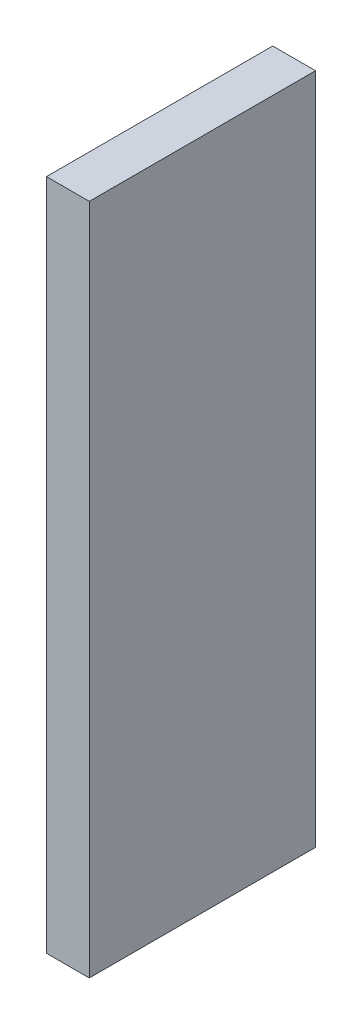
ISO-10303-21;
HEADER;
FILE_DESCRIPTION(('STEP AP214'),'2;1');
FILE_NAME('part.step','',(''),(''),'','','');
FILE_SCHEMA(('AUTOMOTIVE_DESIGN { 1 0 10303 214 1 1 1 1 }'));
ENDSEC;
DATA;
#1=APPLICATION_CONTEXT('core data for automotive mechanical design processes');
#2=APPLICATION_PROTOCOL_DEFINITION('international standard','automotive_design',2000,#1);
#3=PRODUCT_CONTEXT('',#1,'mechanical');
#4=PRODUCT('Part','Part','',(#3));
#5=PRODUCT_RELATED_PRODUCT_CATEGORY('part','',(#4));
#6=PRODUCT_DEFINITION_FORMATION('','',#4);
#7=PRODUCT_DEFINITION_CONTEXT('part definition',#1,'design');
#8=PRODUCT_DEFINITION('design','',#6,#7);
#9=PRODUCT_DEFINITION_SHAPE('','',#8);
#10=(LENGTH_UNIT() NAMED_UNIT(*) SI_UNIT(.MILLI.,.METRE.));
#11=(NAMED_UNIT(*) PLANE_ANGLE_UNIT() SI_UNIT($,.RADIAN.));
#12=(NAMED_UNIT(*) SI_UNIT($,.STERADIAN.) SOLID_ANGLE_UNIT());
#13=UNCERTAINTY_MEASURE_WITH_UNIT(LENGTH_MEASURE(1.E-05),#10,'distance_accuracy_value','');
#14=(GEOMETRIC_REPRESENTATION_CONTEXT(3) GLOBAL_UNCERTAINTY_ASSIGNED_CONTEXT((#13)) GLOBAL_UNIT_ASSIGNED_CONTEXT((#10,
#11,#12)) REPRESENTATION_CONTEXT('',''));
#15=CARTESIAN_POINT('',(0.,0.,0.));
#16=DIRECTION('',(0.,0.,1.));
#17=DIRECTION('',(1.,0.,0.));
#18=AXIS2_PLACEMENT_3D('',#15,#16,#17);
#19=CARTESIAN_POINT('',(2.80000000000001,0.,14.8));
#20=DIRECTION('',(0.,1.,0.));
#21=DIRECTION('',(-1.,0.,0.));
#22=AXIS2_PLACEMENT_3D('',#19,#20,#21);
#23=PLANE('',#22);
#24=DIRECTION('',(1.,0.,0.));
#25=VECTOR('',#24,1.);
#26=CARTESIAN_POINT('',(2.80000000000001,0.,0.));
#27=LINE('',#26,#25);
#28=CARTESIAN_POINT('',(0.,0.,0.));
#29=VERTEX_POINT('',#28);
#30=CARTESIAN_POINT('',(2.80000000000001,0.,0.));
#31=VERTEX_POINT('',#30);
#32=EDGE_CURVE('E111',#29,#31,#27,.T.);
#33=ORIENTED_EDGE('',*,*,#32,.T.);
#34=DIRECTION('',(0.,0.,-1.));
#35=VECTOR('',#34,1.);
#36=CARTESIAN_POINT('',(2.80000000000001,0.,14.8));
#37=LINE('',#36,#35);
#38=CARTESIAN_POINT('',(2.80000000000001,0.,14.8));
#39=VERTEX_POINT('',#38);
#40=EDGE_CURVE('E11',#39,#31,#37,.T.);
#41=ORIENTED_EDGE('',*,*,#40,.F.);
#42=DIRECTION('',(1.,0.,0.));
#43=VECTOR('',#42,1.);
#44=CARTESIAN_POINT('',(2.80000000000001,0.,14.8));
#45=LINE('',#44,#43);
#46=CARTESIAN_POINT('',(0.,0.,14.8));
#47=VERTEX_POINT('',#46);
#48=EDGE_CURVE('E95',#47,#39,#45,.T.);
#49=ORIENTED_EDGE('',*,*,#48,.F.);
#50=DIRECTION('',(0.,0.,-1.));
#51=VECTOR('',#50,1.);
#52=CARTESIAN_POINT('',(0.,0.,14.8));
#53=LINE('',#52,#51);
#54=EDGE_CURVE('E107',#47,#29,#53,.T.);
#55=ORIENTED_EDGE('',*,*,#54,.T.);
#56=EDGE_LOOP('',(#33,#41,#49,#55));
#57=FACE_BOUND('',#56,.T.);
#58=ADVANCED_FACE('F43',(#57),#23,.F.);
#59=CARTESIAN_POINT('',(2.8,44.,14.8));
#60=DIRECTION('',(-1.,0.,0.));
#61=DIRECTION('',(0.,-1.,0.));
#62=AXIS2_PLACEMENT_3D('',#59,#60,#61);
#63=PLANE('',#62);
#64=DIRECTION('',(0.,1.,0.));
#65=VECTOR('',#64,1.);
#66=CARTESIAN_POINT('',(2.8,44.,0.));
#67=LINE('',#66,#65);
#68=CARTESIAN_POINT('',(2.8,44.,0.));
#69=VERTEX_POINT('',#68);
#70=EDGE_CURVE('E100',#31,#69,#67,.T.);
#71=ORIENTED_EDGE('',*,*,#70,.T.);
#72=DIRECTION('',(0.,0.,-1.));
#73=VECTOR('',#72,1.);
#74=CARTESIAN_POINT('',(2.8,44.,14.8));
#75=LINE('',#74,#73);
#76=CARTESIAN_POINT('',(2.8,44.,14.8));
#77=VERTEX_POINT('',#76);
#78=EDGE_CURVE('E52',#77,#69,#75,.T.);
#79=ORIENTED_EDGE('',*,*,#78,.F.);
#80=DIRECTION('',(0.,1.,0.));
#81=VECTOR('',#80,1.);
#82=CARTESIAN_POINT('',(2.8,44.,14.8));
#83=LINE('',#82,#81);
#84=EDGE_CURVE('E90',#39,#77,#83,.T.);
#85=ORIENTED_EDGE('',*,*,#84,.F.);
#86=ORIENTED_EDGE('',*,*,#40,.T.);
#87=EDGE_LOOP('',(#71,#79,#85,#86));
#88=FACE_BOUND('',#87,.T.);
#89=ADVANCED_FACE('F99',(#88),#63,.F.);
#90=CARTESIAN_POINT('',(0.,44.,14.8));
#91=DIRECTION('',(0.,-1.,0.));
#92=DIRECTION('',(0.,0.,-1.));
#93=AXIS2_PLACEMENT_3D('',#90,#91,#92);
#94=PLANE('',#93);
#95=DIRECTION('',(-1.,0.,0.));
#96=VECTOR('',#95,1.);
#97=CARTESIAN_POINT('',(0.,44.,0.));
#98=LINE('',#97,#96);
#99=CARTESIAN_POINT('',(0.,44.,0.));
#100=VERTEX_POINT('',#99);
#101=EDGE_CURVE('E77',#69,#100,#98,.T.);
#102=ORIENTED_EDGE('',*,*,#101,.T.);
#103=DIRECTION('',(0.,0.,-1.));
#104=VECTOR('',#103,1.);
#105=CARTESIAN_POINT('',(0.,44.,14.8));
#106=LINE('',#105,#104);
#107=CARTESIAN_POINT('',(0.,44.,14.8));
#108=VERTEX_POINT('',#107);
#109=EDGE_CURVE('E102',#108,#100,#106,.T.);
#110=ORIENTED_EDGE('',*,*,#109,.F.);
#111=DIRECTION('',(-1.,0.,0.));
#112=VECTOR('',#111,1.);
#113=CARTESIAN_POINT('',(0.,44.,14.8));
#114=LINE('',#113,#112);
#115=EDGE_CURVE('E93',#77,#108,#114,.T.);
#116=ORIENTED_EDGE('',*,*,#115,.F.);
#117=ORIENTED_EDGE('',*,*,#78,.T.);
#118=EDGE_LOOP('',(#102,#110,#116,#117));
#119=FACE_BOUND('',#118,.T.);
#120=ADVANCED_FACE('F103',(#119),#94,.F.);
#121=CARTESIAN_POINT('',(0.,0.,14.8));
#122=DIRECTION('',(1.,0.,0.));
#123=DIRECTION('',(0.,0.,-1.));
#124=AXIS2_PLACEMENT_3D('',#121,#122,#123);
#125=PLANE('',#124);
#126=DIRECTION('',(0.,-1.,0.));
#127=VECTOR('',#126,1.);
#128=CARTESIAN_POINT('',(0.,0.,0.));
#129=LINE('',#128,#127);
#130=EDGE_CURVE('E83',#100,#29,#129,.T.);
#131=ORIENTED_EDGE('',*,*,#130,.T.);
#132=ORIENTED_EDGE('',*,*,#54,.F.);
#133=DIRECTION('',(0.,-1.,0.));
#134=VECTOR('',#133,1.);
#135=CARTESIAN_POINT('',(0.,0.,14.8));
#136=LINE('',#135,#134);
#137=EDGE_CURVE('E60',#108,#47,#136,.T.);
#138=ORIENTED_EDGE('',*,*,#137,.F.);
#139=ORIENTED_EDGE('',*,*,#109,.T.);
#140=EDGE_LOOP('',(#131,#132,#138,#139));
#141=FACE_BOUND('',#140,.T.);
#142=ADVANCED_FACE('F124',(#141),#125,.F.);
#143=CARTESIAN_POINT('',(0.,0.,14.8));
#144=DIRECTION('',(0.,0.,-1.));
#145=DIRECTION('',(-1.,0.,0.));
#146=AXIS2_PLACEMENT_3D('',#143,#144,#145);
#147=PLANE('',#146);
#148=ORIENTED_EDGE('',*,*,#48,.T.);
#149=ORIENTED_EDGE('',*,*,#84,.T.);
#150=ORIENTED_EDGE('',*,*,#115,.T.);
#151=ORIENTED_EDGE('',*,*,#137,.T.);
#152=EDGE_LOOP('',(#148,#149,#150,#151));
#153=FACE_BOUND('',#152,.T.);
#154=ADVANCED_FACE('F91',(#153),#147,.F.);
#155=CARTESIAN_POINT('',(0.,0.,0.));
#156=DIRECTION('',(0.,0.,-1.));
#157=DIRECTION('',(-1.,0.,0.));
#158=AXIS2_PLACEMENT_3D('',#155,#156,#157);
#159=PLANE('',#158);
#160=ORIENTED_EDGE('',*,*,#32,.F.);
#161=ORIENTED_EDGE('',*,*,#130,.F.);
#162=ORIENTED_EDGE('',*,*,#101,.F.);
#163=ORIENTED_EDGE('',*,*,#70,.F.);
#164=EDGE_LOOP('',(#160,#161,#162,#163));
#165=FACE_BOUND('',#164,.T.);
#166=ADVANCED_FACE('F127',(#165),#159,.T.);
#167=CLOSED_SHELL('',(#58,#89,#120,#142,#154,#166));
#168=MANIFOLD_SOLID_BREP('B2',#167);
#169=ADVANCED_BREP_SHAPE_REPRESENTATION('',(#18,#168),#14);
#170=SHAPE_DEFINITION_REPRESENTATION(#9,#169);
ENDSEC;
END-ISO-10303-21;
